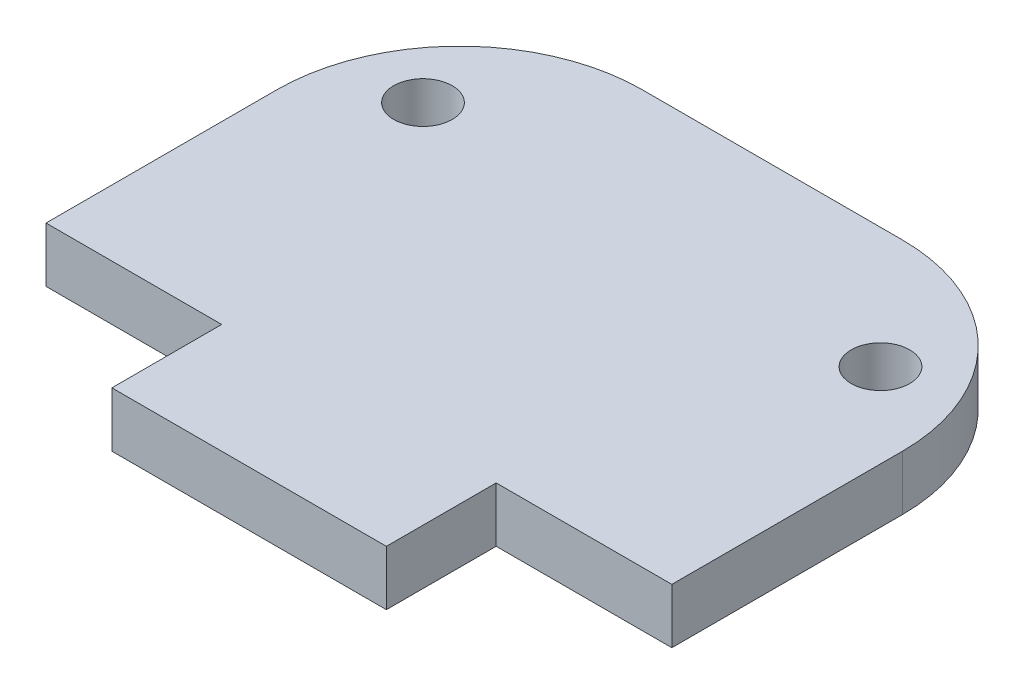
ISO-10303-21;
HEADER;
FILE_DESCRIPTION(('STEP AP214'),'2;1');
FILE_NAME('part.step','',(''),(''),'','','');
FILE_SCHEMA(('AUTOMOTIVE_DESIGN { 1 0 10303 214 1 1 1 1 }'));
ENDSEC;
DATA;
#1=APPLICATION_CONTEXT('core data for automotive mechanical design processes');
#2=APPLICATION_PROTOCOL_DEFINITION('international standard','automotive_design',2000,#1);
#3=PRODUCT_CONTEXT('',#1,'mechanical');
#4=PRODUCT('Part','Part','',(#3));
#5=PRODUCT_RELATED_PRODUCT_CATEGORY('part','',(#4));
#6=PRODUCT_DEFINITION_FORMATION('','',#4);
#7=PRODUCT_DEFINITION_CONTEXT('part definition',#1,'design');
#8=PRODUCT_DEFINITION('design','',#6,#7);
#9=PRODUCT_DEFINITION_SHAPE('','',#8);
#10=(LENGTH_UNIT() NAMED_UNIT(*) SI_UNIT(.MILLI.,.METRE.));
#11=(NAMED_UNIT(*) PLANE_ANGLE_UNIT() SI_UNIT($,.RADIAN.));
#12=(NAMED_UNIT(*) SI_UNIT($,.STERADIAN.) SOLID_ANGLE_UNIT());
#13=UNCERTAINTY_MEASURE_WITH_UNIT(LENGTH_MEASURE(1.E-05),#10,'distance_accuracy_value','');
#14=(GEOMETRIC_REPRESENTATION_CONTEXT(3) GLOBAL_UNCERTAINTY_ASSIGNED_CONTEXT((#13)) GLOBAL_UNIT_ASSIGNED_CONTEXT((#10,
#11,#12)) REPRESENTATION_CONTEXT('',''));
#15=CARTESIAN_POINT('',(0.,0.,0.));
#16=DIRECTION('',(0.,0.,1.));
#17=DIRECTION('',(1.,0.,0.));
#18=AXIS2_PLACEMENT_3D('',#15,#16,#17);
#19=CARTESIAN_POINT('',(-7.1,0.,-18.6));
#20=DIRECTION('',(0.,-1.,0.));
#21=DIRECTION('',(0.,0.,-1.));
#22=AXIS2_PLACEMENT_3D('',#19,#20,#21);
#23=CYLINDRICAL_SURFACE('',#22,9.99999999999999);
#24=CARTESIAN_POINT('',(-7.1,-3.,-18.6));
#25=DIRECTION('',(0.,-1.,0.));
#26=DIRECTION('',(0.,0.,-1.));
#27=AXIS2_PLACEMENT_3D('',#24,#25,#26);
#28=CIRCLE('',#27,9.99999999999999);
#29=CARTESIAN_POINT('',(-17.1,-3.,-18.6));
#30=VERTEX_POINT('',#29);
#31=CARTESIAN_POINT('',(-7.1,-3.,-28.6));
#32=VERTEX_POINT('',#31);
#33=EDGE_CURVE('E142',#30,#32,#28,.T.);
#34=ORIENTED_EDGE('',*,*,#33,.F.);
#35=DIRECTION('',(0.,-1.,0.));
#36=VECTOR('',#35,1.);
#37=CARTESIAN_POINT('',(-17.1,0.,-18.6));
#38=LINE('',#37,#36);
#39=CARTESIAN_POINT('',(-17.1,0.,-18.6));
#40=VERTEX_POINT('',#39);
#41=EDGE_CURVE('E11',#40,#30,#38,.T.);
#42=ORIENTED_EDGE('',*,*,#41,.F.);
#43=CARTESIAN_POINT('',(-7.1,0.,-18.6));
#44=DIRECTION('',(0.,-1.,0.));
#45=DIRECTION('',(0.,0.,-1.));
#46=AXIS2_PLACEMENT_3D('',#43,#44,#45);
#47=CIRCLE('',#46,9.99999999999999);
#48=CARTESIAN_POINT('',(-7.1,0.,-28.6));
#49=VERTEX_POINT('',#48);
#50=EDGE_CURVE('E169',#40,#49,#47,.T.);
#51=ORIENTED_EDGE('',*,*,#50,.T.);
#52=DIRECTION('',(0.,-1.,0.));
#53=VECTOR('',#52,1.);
#54=CARTESIAN_POINT('',(-7.1,0.,-28.6));
#55=LINE('',#54,#53);
#56=EDGE_CURVE('E36',#49,#32,#55,.T.);
#57=ORIENTED_EDGE('',*,*,#56,.T.);
#58=EDGE_LOOP('',(#34,#42,#51,#57));
#59=FACE_BOUND('',#58,.T.);
#60=ADVANCED_FACE('F33',(#59),#23,.T.);
#61=CARTESIAN_POINT('',(-17.1,0.,-6.00000000000001));
#62=DIRECTION('',(-1.,0.,0.));
#63=DIRECTION('',(0.,0.,1.));
#64=AXIS2_PLACEMENT_3D('',#61,#62,#63);
#65=PLANE('',#64);
#66=DIRECTION('',(0.,0.,-1.));
#67=VECTOR('',#66,1.);
#68=CARTESIAN_POINT('',(-17.1,-3.,-6.00000000000001));
#69=LINE('',#68,#67);
#70=CARTESIAN_POINT('',(-17.1,-3.,-6.00000000000001));
#71=VERTEX_POINT('',#70);
#72=EDGE_CURVE('E167',#71,#30,#69,.T.);
#73=ORIENTED_EDGE('',*,*,#72,.F.);
#74=DIRECTION('',(0.,-1.,0.));
#75=VECTOR('',#74,1.);
#76=CARTESIAN_POINT('',(-17.1,0.,-6.00000000000001));
#77=LINE('',#76,#75);
#78=CARTESIAN_POINT('',(-17.1,0.,-6.00000000000001));
#79=VERTEX_POINT('',#78);
#80=EDGE_CURVE('E42',#79,#71,#77,.T.);
#81=ORIENTED_EDGE('',*,*,#80,.F.);
#82=DIRECTION('',(0.,0.,-1.));
#83=VECTOR('',#82,1.);
#84=CARTESIAN_POINT('',(-17.1,0.,-6.00000000000001));
#85=LINE('',#84,#83);
#86=EDGE_CURVE('E132',#79,#40,#85,.T.);
#87=ORIENTED_EDGE('',*,*,#86,.T.);
#88=ORIENTED_EDGE('',*,*,#41,.T.);
#89=EDGE_LOOP('',(#73,#81,#87,#88));
#90=FACE_BOUND('',#89,.T.);
#91=ADVANCED_FACE('F185',(#90),#65,.T.);
#92=CARTESIAN_POINT('',(-7.5,0.,-6.00000000000001));
#93=DIRECTION('',(0.,0.,1.));
#94=DIRECTION('',(1.,0.,0.));
#95=AXIS2_PLACEMENT_3D('',#92,#93,#94);
#96=PLANE('',#95);
#97=DIRECTION('',(-1.,0.,0.));
#98=VECTOR('',#97,1.);
#99=CARTESIAN_POINT('',(-7.5,-3.,-6.00000000000001));
#100=LINE('',#99,#98);
#101=CARTESIAN_POINT('',(-7.5,-3.,-6.00000000000001));
#102=VERTEX_POINT('',#101);
#103=EDGE_CURVE('E119',#102,#71,#100,.T.);
#104=ORIENTED_EDGE('',*,*,#103,.F.);
#105=DIRECTION('',(0.,-1.,0.));
#106=VECTOR('',#105,1.);
#107=CARTESIAN_POINT('',(-7.5,0.,-6.00000000000001));
#108=LINE('',#107,#106);
#109=CARTESIAN_POINT('',(-7.5,0.,-6.00000000000001));
#110=VERTEX_POINT('',#109);
#111=EDGE_CURVE('E114',#110,#102,#108,.T.);
#112=ORIENTED_EDGE('',*,*,#111,.F.);
#113=DIRECTION('',(-1.,0.,0.));
#114=VECTOR('',#113,1.);
#115=CARTESIAN_POINT('',(-7.5,0.,-6.00000000000001));
#116=LINE('',#115,#114);
#117=EDGE_CURVE('E117',#110,#79,#116,.T.);
#118=ORIENTED_EDGE('',*,*,#117,.T.);
#119=ORIENTED_EDGE('',*,*,#80,.T.);
#120=EDGE_LOOP('',(#104,#112,#118,#119));
#121=FACE_BOUND('',#120,.T.);
#122=ADVANCED_FACE('F116',(#121),#96,.T.);
#123=CARTESIAN_POINT('',(-7.5,0.,0.));
#124=DIRECTION('',(-1.,0.,0.));
#125=DIRECTION('',(0.,0.,1.));
#126=AXIS2_PLACEMENT_3D('',#123,#124,#125);
#127=PLANE('',#126);
#128=DIRECTION('',(0.,0.,-1.));
#129=VECTOR('',#128,1.);
#130=CARTESIAN_POINT('',(-7.5,-3.,0.));
#131=LINE('',#130,#129);
#132=CARTESIAN_POINT('',(-7.5,-3.,0.));
#133=VERTEX_POINT('',#132);
#134=EDGE_CURVE('E164',#133,#102,#131,.T.);
#135=ORIENTED_EDGE('',*,*,#134,.F.);
#136=DIRECTION('',(0.,-1.,0.));
#137=VECTOR('',#136,1.);
#138=CARTESIAN_POINT('',(-7.5,0.,0.));
#139=LINE('',#138,#137);
#140=CARTESIAN_POINT('',(-7.5,0.,0.));
#141=VERTEX_POINT('',#140);
#142=EDGE_CURVE('E124',#141,#133,#139,.T.);
#143=ORIENTED_EDGE('',*,*,#142,.F.);
#144=DIRECTION('',(0.,0.,-1.));
#145=VECTOR('',#144,1.);
#146=CARTESIAN_POINT('',(-7.5,0.,0.));
#147=LINE('',#146,#145);
#148=EDGE_CURVE('E130',#141,#110,#147,.T.);
#149=ORIENTED_EDGE('',*,*,#148,.T.);
#150=ORIENTED_EDGE('',*,*,#111,.T.);
#151=EDGE_LOOP('',(#135,#143,#149,#150));
#152=FACE_BOUND('',#151,.T.);
#153=ADVANCED_FACE('F134',(#152),#127,.T.);
#154=CARTESIAN_POINT('',(7.5,0.,0.));
#155=DIRECTION('',(0.,0.,1.));
#156=DIRECTION('',(1.,0.,0.));
#157=AXIS2_PLACEMENT_3D('',#154,#155,#156);
#158=PLANE('',#157);
#159=DIRECTION('',(-1.,0.,0.));
#160=VECTOR('',#159,1.);
#161=CARTESIAN_POINT('',(7.5,-3.,0.));
#162=LINE('',#161,#160);
#163=CARTESIAN_POINT('',(7.5,-3.,0.));
#164=VERTEX_POINT('',#163);
#165=EDGE_CURVE('E161',#164,#133,#162,.T.);
#166=ORIENTED_EDGE('',*,*,#165,.F.);
#167=DIRECTION('',(0.,-1.,0.));
#168=VECTOR('',#167,1.);
#169=CARTESIAN_POINT('',(7.5,0.,0.));
#170=LINE('',#169,#168);
#171=CARTESIAN_POINT('',(7.5,0.,0.));
#172=VERTEX_POINT('',#171);
#173=EDGE_CURVE('E173',#172,#164,#170,.T.);
#174=ORIENTED_EDGE('',*,*,#173,.F.);
#175=DIRECTION('',(-1.,0.,0.));
#176=VECTOR('',#175,1.);
#177=CARTESIAN_POINT('',(7.5,0.,0.));
#178=LINE('',#177,#176);
#179=EDGE_CURVE('E135',#172,#141,#178,.T.);
#180=ORIENTED_EDGE('',*,*,#179,.T.);
#181=ORIENTED_EDGE('',*,*,#142,.T.);
#182=EDGE_LOOP('',(#166,#174,#180,#181));
#183=FACE_BOUND('',#182,.T.);
#184=ADVANCED_FACE('F198',(#183),#158,.T.);
#185=CARTESIAN_POINT('',(7.5,0.,-6.00000000000001));
#186=DIRECTION('',(1.,0.,0.));
#187=DIRECTION('',(0.,0.,-1.));
#188=AXIS2_PLACEMENT_3D('',#185,#186,#187);
#189=PLANE('',#188);
#190=DIRECTION('',(0.,0.,1.));
#191=VECTOR('',#190,1.);
#192=CARTESIAN_POINT('',(7.5,-3.,-6.00000000000001));
#193=LINE('',#192,#191);
#194=CARTESIAN_POINT('',(7.5,-3.,-6.00000000000001));
#195=VERTEX_POINT('',#194);
#196=EDGE_CURVE('E158',#195,#164,#193,.T.);
#197=ORIENTED_EDGE('',*,*,#196,.F.);
#198=DIRECTION('',(0.,-1.,0.));
#199=VECTOR('',#198,1.);
#200=CARTESIAN_POINT('',(7.5,0.,-6.00000000000001));
#201=LINE('',#200,#199);
#202=CARTESIAN_POINT('',(7.5,0.,-6.00000000000001));
#203=VERTEX_POINT('',#202);
#204=EDGE_CURVE('E175',#203,#195,#201,.T.);
#205=ORIENTED_EDGE('',*,*,#204,.F.);
#206=DIRECTION('',(0.,0.,1.));
#207=VECTOR('',#206,1.);
#208=CARTESIAN_POINT('',(7.5,0.,-6.00000000000001));
#209=LINE('',#208,#207);
#210=EDGE_CURVE('E137',#203,#172,#209,.T.);
#211=ORIENTED_EDGE('',*,*,#210,.T.);
#212=ORIENTED_EDGE('',*,*,#173,.T.);
#213=EDGE_LOOP('',(#197,#205,#211,#212));
#214=FACE_BOUND('',#213,.T.);
#215=ADVANCED_FACE('F201',(#214),#189,.T.);
#216=CARTESIAN_POINT('',(17.1,0.,-6.00000000000001));
#217=DIRECTION('',(0.,0.,1.));
#218=DIRECTION('',(1.,0.,0.));
#219=AXIS2_PLACEMENT_3D('',#216,#217,#218);
#220=PLANE('',#219);
#221=DIRECTION('',(-1.,0.,0.));
#222=VECTOR('',#221,1.);
#223=CARTESIAN_POINT('',(17.1,-3.,-6.00000000000001));
#224=LINE('',#223,#222);
#225=CARTESIAN_POINT('',(17.1,-3.,-6.00000000000001));
#226=VERTEX_POINT('',#225);
#227=EDGE_CURVE('E155',#226,#195,#224,.T.);
#228=ORIENTED_EDGE('',*,*,#227,.F.);
#229=DIRECTION('',(0.,-1.,0.));
#230=VECTOR('',#229,1.);
#231=CARTESIAN_POINT('',(17.1,0.,-6.00000000000001));
#232=LINE('',#231,#230);
#233=CARTESIAN_POINT('',(17.1,0.,-6.00000000000001));
#234=VERTEX_POINT('',#233);
#235=EDGE_CURVE('E177',#234,#226,#232,.T.);
#236=ORIENTED_EDGE('',*,*,#235,.F.);
#237=DIRECTION('',(-1.,0.,0.));
#238=VECTOR('',#237,1.);
#239=CARTESIAN_POINT('',(17.1,0.,-6.00000000000001));
#240=LINE('',#239,#238);
#241=EDGE_CURVE('E261',#234,#203,#240,.T.);
#242=ORIENTED_EDGE('',*,*,#241,.T.);
#243=ORIENTED_EDGE('',*,*,#204,.T.);
#244=EDGE_LOOP('',(#228,#236,#242,#243));
#245=FACE_BOUND('',#244,.T.);
#246=ADVANCED_FACE('F205',(#245),#220,.T.);
#247=CARTESIAN_POINT('',(17.1,0.,-18.6));
#248=DIRECTION('',(1.,0.,0.));
#249=DIRECTION('',(0.,0.,-1.));
#250=AXIS2_PLACEMENT_3D('',#247,#248,#249);
#251=PLANE('',#250);
#252=DIRECTION('',(0.,0.,1.));
#253=VECTOR('',#252,1.);
#254=CARTESIAN_POINT('',(17.1,-3.,-18.6));
#255=LINE('',#254,#253);
#256=CARTESIAN_POINT('',(17.1,-3.,-18.6));
#257=VERTEX_POINT('',#256);
#258=EDGE_CURVE('E152',#257,#226,#255,.T.);
#259=ORIENTED_EDGE('',*,*,#258,.F.);
#260=DIRECTION('',(0.,-1.,0.));
#261=VECTOR('',#260,1.);
#262=CARTESIAN_POINT('',(17.1,0.,-18.6));
#263=LINE('',#262,#261);
#264=CARTESIAN_POINT('',(17.1,0.,-18.6));
#265=VERTEX_POINT('',#264);
#266=EDGE_CURVE('E179',#265,#257,#263,.T.);
#267=ORIENTED_EDGE('',*,*,#266,.F.);
#268=DIRECTION('',(0.,0.,1.));
#269=VECTOR('',#268,1.);
#270=CARTESIAN_POINT('',(17.1,0.,-18.6));
#271=LINE('',#270,#269);
#272=EDGE_CURVE('E258',#265,#234,#271,.T.);
#273=ORIENTED_EDGE('',*,*,#272,.T.);
#274=ORIENTED_EDGE('',*,*,#235,.T.);
#275=EDGE_LOOP('',(#259,#267,#273,#274));
#276=FACE_BOUND('',#275,.T.);
#277=ADVANCED_FACE('F209',(#276),#251,.T.);
#278=CARTESIAN_POINT('',(7.1,0.,-18.6));
#279=DIRECTION('',(0.,-1.,0.));
#280=DIRECTION('',(0.,0.,-1.));
#281=AXIS2_PLACEMENT_3D('',#278,#279,#280);
#282=CYLINDRICAL_SURFACE('',#281,9.99999999999999);
#283=CARTESIAN_POINT('',(7.1,-3.,-18.6));
#284=DIRECTION('',(0.,-1.,0.));
#285=DIRECTION('',(0.,0.,-1.));
#286=AXIS2_PLACEMENT_3D('',#283,#284,#285);
#287=CIRCLE('',#286,9.99999999999999);
#288=CARTESIAN_POINT('',(7.1,-3.,-28.6));
#289=VERTEX_POINT('',#288);
#290=EDGE_CURVE('E149',#289,#257,#287,.T.);
#291=ORIENTED_EDGE('',*,*,#290,.F.);
#292=DIRECTION('',(0.,-1.,0.));
#293=VECTOR('',#292,1.);
#294=CARTESIAN_POINT('',(7.1,0.,-28.6));
#295=LINE('',#294,#293);
#296=CARTESIAN_POINT('',(7.1,0.,-28.6));
#297=VERTEX_POINT('',#296);
#298=EDGE_CURVE('E180',#297,#289,#295,.T.);
#299=ORIENTED_EDGE('',*,*,#298,.F.);
#300=CARTESIAN_POINT('',(7.1,0.,-18.6));
#301=DIRECTION('',(0.,-1.,0.));
#302=DIRECTION('',(0.,0.,-1.));
#303=AXIS2_PLACEMENT_3D('',#300,#301,#302);
#304=CIRCLE('',#303,9.99999999999999);
#305=EDGE_CURVE('E255',#297,#265,#304,.T.);
#306=ORIENTED_EDGE('',*,*,#305,.T.);
#307=ORIENTED_EDGE('',*,*,#266,.T.);
#308=EDGE_LOOP('',(#291,#299,#306,#307));
#309=FACE_BOUND('',#308,.T.);
#310=ADVANCED_FACE('F213',(#309),#282,.T.);
#311=CARTESIAN_POINT('',(-7.1,0.,-28.6));
#312=DIRECTION('',(0.,0.,-1.));
#313=DIRECTION('',(-1.,0.,0.));
#314=AXIS2_PLACEMENT_3D('',#311,#312,#313);
#315=PLANE('',#314);
#316=DIRECTION('',(1.,0.,0.));
#317=VECTOR('',#316,1.);
#318=CARTESIAN_POINT('',(-7.1,-3.,-28.6));
#319=LINE('',#318,#317);
#320=EDGE_CURVE('E145',#32,#289,#319,.T.);
#321=ORIENTED_EDGE('',*,*,#320,.F.);
#322=ORIENTED_EDGE('',*,*,#56,.F.);
#323=DIRECTION('',(1.,0.,0.));
#324=VECTOR('',#323,1.);
#325=CARTESIAN_POINT('',(-7.1,0.,-28.6));
#326=LINE('',#325,#324);
#327=EDGE_CURVE('E253',#49,#297,#326,.T.);
#328=ORIENTED_EDGE('',*,*,#327,.T.);
#329=ORIENTED_EDGE('',*,*,#298,.T.);
#330=EDGE_LOOP('',(#321,#322,#328,#329));
#331=FACE_BOUND('',#330,.T.);
#332=ADVANCED_FACE('F182',(#331),#315,.T.);
#333=CARTESIAN_POINT('',(-7.1,0.,-18.6));
#334=DIRECTION('',(0.,-1.,0.));
#335=DIRECTION('',(0.,0.,-1.));
#336=AXIS2_PLACEMENT_3D('',#333,#334,#335);
#337=PLANE('',#336);
#338=CARTESIAN_POINT('',(12.5,0.,-22.));
#339=DIRECTION('',(0.,-1.,0.));
#340=DIRECTION('',(0.,0.,1.));
#341=AXIS2_PLACEMENT_3D('',#338,#339,#340);
#342=CIRCLE('',#341,1.59999999999999);
#343=CARTESIAN_POINT('',(12.5,0.,-23.6));
#344=VERTEX_POINT('',#343);
#345=EDGE_CURVE('E240',#344,#344,#342,.T.);
#346=ORIENTED_EDGE('',*,*,#345,.T.);
#347=EDGE_LOOP('',(#346));
#348=FACE_BOUND('',#347,.T.);
#349=CARTESIAN_POINT('',(-12.5,0.,-22.));
#350=DIRECTION('',(0.,-1.,0.));
#351=DIRECTION('',(0.,0.,1.));
#352=AXIS2_PLACEMENT_3D('',#349,#350,#351);
#353=CIRCLE('',#352,1.59999999999999);
#354=CARTESIAN_POINT('',(-12.5,0.,-23.6));
#355=VERTEX_POINT('',#354);
#356=EDGE_CURVE('E146',#355,#355,#353,.T.);
#357=ORIENTED_EDGE('',*,*,#356,.T.);
#358=EDGE_LOOP('',(#357));
#359=FACE_BOUND('',#358,.T.);
#360=ORIENTED_EDGE('',*,*,#50,.F.);
#361=ORIENTED_EDGE('',*,*,#86,.F.);
#362=ORIENTED_EDGE('',*,*,#117,.F.);
#363=ORIENTED_EDGE('',*,*,#148,.F.);
#364=ORIENTED_EDGE('',*,*,#179,.F.);
#365=ORIENTED_EDGE('',*,*,#210,.F.);
#366=ORIENTED_EDGE('',*,*,#241,.F.);
#367=ORIENTED_EDGE('',*,*,#272,.F.);
#368=ORIENTED_EDGE('',*,*,#305,.F.);
#369=ORIENTED_EDGE('',*,*,#327,.F.);
#370=EDGE_LOOP('',(#360,#361,#362,#363,#364,#365,#366,#367,#368,#369));
#371=FACE_BOUND('',#370,.T.);
#372=ADVANCED_FACE('F128',(#348,#359,#371),#337,.F.);
#373=CARTESIAN_POINT('',(-7.1,-3.,-18.6));
#374=DIRECTION('',(0.,-1.,0.));
#375=DIRECTION('',(0.,0.,-1.));
#376=AXIS2_PLACEMENT_3D('',#373,#374,#375);
#377=PLANE('',#376);
#378=CARTESIAN_POINT('',(12.5,-3.,-22.));
#379=DIRECTION('',(0.,-1.,0.));
#380=DIRECTION('',(0.,0.,1.));
#381=AXIS2_PLACEMENT_3D('',#378,#379,#380);
#382=CIRCLE('',#381,1.59999999999999);
#383=CARTESIAN_POINT('',(12.5,-3.,-23.6));
#384=VERTEX_POINT('',#383);
#385=EDGE_CURVE('E243',#384,#384,#382,.T.);
#386=ORIENTED_EDGE('',*,*,#385,.F.);
#387=EDGE_LOOP('',(#386));
#388=FACE_BOUND('',#387,.T.);
#389=CARTESIAN_POINT('',(-12.5,-3.,-22.));
#390=DIRECTION('',(0.,-1.,0.));
#391=DIRECTION('',(0.,0.,1.));
#392=AXIS2_PLACEMENT_3D('',#389,#390,#391);
#393=CIRCLE('',#392,1.59999999999999);
#394=CARTESIAN_POINT('',(-12.5,-3.,-23.6));
#395=VERTEX_POINT('',#394);
#396=EDGE_CURVE('E245',#395,#395,#393,.T.);
#397=ORIENTED_EDGE('',*,*,#396,.F.);
#398=EDGE_LOOP('',(#397));
#399=FACE_BOUND('',#398,.T.);
#400=ORIENTED_EDGE('',*,*,#33,.T.);
#401=ORIENTED_EDGE('',*,*,#320,.T.);
#402=ORIENTED_EDGE('',*,*,#290,.T.);
#403=ORIENTED_EDGE('',*,*,#258,.T.);
#404=ORIENTED_EDGE('',*,*,#227,.T.);
#405=ORIENTED_EDGE('',*,*,#196,.T.);
#406=ORIENTED_EDGE('',*,*,#165,.T.);
#407=ORIENTED_EDGE('',*,*,#134,.T.);
#408=ORIENTED_EDGE('',*,*,#103,.T.);
#409=ORIENTED_EDGE('',*,*,#72,.T.);
#410=EDGE_LOOP('',(#400,#401,#402,#403,#404,#405,#406,#407,#408,#409));
#411=FACE_BOUND('',#410,.T.);
#412=ADVANCED_FACE('F184',(#388,#399,#411),#377,.T.);
#413=CARTESIAN_POINT('',(-12.5,0.,-22.));
#414=DIRECTION('',(0.,-1.,0.));
#415=DIRECTION('',(0.,0.,-1.));
#416=AXIS2_PLACEMENT_3D('',#413,#414,#415);
#417=CYLINDRICAL_SURFACE('',#416,1.59999999999999);
#418=CARTESIAN_POINT('',(-12.5,0.,-23.6));
#419=CARTESIAN_POINT('',(-12.5,-0.0312499999999995,-23.6));
#420=CARTESIAN_POINT('',(-12.5,-0.0624999999999996,-23.6));
#421=CARTESIAN_POINT('',(-12.5,-0.125,-23.6));
#422=CARTESIAN_POINT('',(-12.5,-0.15625,-23.6));
#423=CARTESIAN_POINT('',(-12.5,-0.21875,-23.6));
#424=CARTESIAN_POINT('',(-12.5,-0.25,-23.6));
#425=CARTESIAN_POINT('',(-12.5,-0.3125,-23.6));
#426=CARTESIAN_POINT('',(-12.5,-0.34375,-23.6));
#427=CARTESIAN_POINT('',(-12.5,-0.40625,-23.6));
#428=CARTESIAN_POINT('',(-12.5,-0.4375,-23.6));
#429=CARTESIAN_POINT('',(-12.5,-0.5,-23.6));
#430=CARTESIAN_POINT('',(-12.5,-0.53125,-23.6));
#431=CARTESIAN_POINT('',(-12.5,-0.59375,-23.6));
#432=CARTESIAN_POINT('',(-12.5,-0.625,-23.6));
#433=CARTESIAN_POINT('',(-12.5,-0.6875,-23.6));
#434=CARTESIAN_POINT('',(-12.5,-0.71875,-23.6));
#435=CARTESIAN_POINT('',(-12.5,-0.78125,-23.6));
#436=CARTESIAN_POINT('',(-12.5,-0.8125,-23.6));
#437=CARTESIAN_POINT('',(-12.5,-0.875,-23.6));
#438=CARTESIAN_POINT('',(-12.5,-0.90625,-23.6));
#439=CARTESIAN_POINT('',(-12.5,-0.96875,-23.6));
#440=CARTESIAN_POINT('',(-12.5,-1.,-23.6));
#441=CARTESIAN_POINT('',(-12.5,-1.0625,-23.6));
#442=CARTESIAN_POINT('',(-12.5,-1.09375,-23.6));
#443=CARTESIAN_POINT('',(-12.5,-1.15625,-23.6));
#444=CARTESIAN_POINT('',(-12.5,-1.1875,-23.6));
#445=CARTESIAN_POINT('',(-12.5,-1.25,-23.6));
#446=CARTESIAN_POINT('',(-12.5,-1.28125,-23.6));
#447=CARTESIAN_POINT('',(-12.5,-1.34375,-23.6));
#448=CARTESIAN_POINT('',(-12.5,-1.375,-23.6));
#449=CARTESIAN_POINT('',(-12.5,-1.4375,-23.6));
#450=CARTESIAN_POINT('',(-12.5,-1.46875,-23.6));
#451=CARTESIAN_POINT('',(-12.5,-1.53125,-23.6));
#452=CARTESIAN_POINT('',(-12.5,-1.5625,-23.6));
#453=CARTESIAN_POINT('',(-12.5,-1.625,-23.6));
#454=CARTESIAN_POINT('',(-12.5,-1.65625,-23.6));
#455=CARTESIAN_POINT('',(-12.5,-1.71875,-23.6));
#456=CARTESIAN_POINT('',(-12.5,-1.75,-23.6));
#457=CARTESIAN_POINT('',(-12.5,-1.8125,-23.6));
#458=CARTESIAN_POINT('',(-12.5,-1.84375,-23.6));
#459=CARTESIAN_POINT('',(-12.5,-1.90625,-23.6));
#460=CARTESIAN_POINT('',(-12.5,-1.9375,-23.6));
#461=CARTESIAN_POINT('',(-12.5,-2.,-23.6));
#462=CARTESIAN_POINT('',(-12.5,-2.03125,-23.6));
#463=CARTESIAN_POINT('',(-12.5,-2.09375,-23.6));
#464=CARTESIAN_POINT('',(-12.5,-2.125,-23.6));
#465=CARTESIAN_POINT('',(-12.5,-2.1875,-23.6));
#466=CARTESIAN_POINT('',(-12.5,-2.21875,-23.6));
#467=CARTESIAN_POINT('',(-12.5,-2.28125,-23.6));
#468=CARTESIAN_POINT('',(-12.5,-2.3125,-23.6));
#469=CARTESIAN_POINT('',(-12.5,-2.375,-23.6));
#470=CARTESIAN_POINT('',(-12.5,-2.40625,-23.6));
#471=CARTESIAN_POINT('',(-12.5,-2.46875,-23.6));
#472=CARTESIAN_POINT('',(-12.5,-2.5,-23.6));
#473=CARTESIAN_POINT('',(-12.5,-2.5625,-23.6));
#474=CARTESIAN_POINT('',(-12.5,-2.59375,-23.6));
#475=CARTESIAN_POINT('',(-12.5,-2.65625,-23.6));
#476=CARTESIAN_POINT('',(-12.5,-2.6875,-23.6));
#477=CARTESIAN_POINT('',(-12.5,-2.75,-23.6));
#478=CARTESIAN_POINT('',(-12.5,-2.78125,-23.6));
#479=CARTESIAN_POINT('',(-12.5,-2.84375,-23.6));
#480=CARTESIAN_POINT('',(-12.5,-2.875,-23.6));
#481=CARTESIAN_POINT('',(-12.5,-2.9375,-23.6));
#482=CARTESIAN_POINT('',(-12.5,-2.96875,-23.6));
#483=CARTESIAN_POINT('',(-12.5,-3.,-23.6));
#484=B_SPLINE_CURVE_WITH_KNOTS('',3,(#418,#419,#420,#421,#422,#423,#424,#425,#426,#427,#428,
#429,#430,#431,#432,#433,#434,#435,#436,#437,#438,#439,#440,#441,#442,#443,#444,#445,#446,#447,
#448,#449,#450,#451,#452,#453,#454,#455,#456,#457,#458,#459,#460,#461,#462,#463,#464,#465,#466,
#467,#468,#469,#470,#471,#472,#473,#474,#475,#476,#477,#478,#479,#480,#481,#482,#483),
.UNSPECIFIED.,.F.,.F.,(4,2,2,2,2,2,2,2,2,2,2,2,2,2,2,2,2,2,2,2,2,2,2,2,2,2,2,2,2,2,2,2,4),(0.,
0.09375,0.1875,0.28125,0.375,0.46875,0.5625,0.65625,0.75,0.84375,0.9375,1.03125,1.125,1.21875,
1.3125,1.40625,1.5,1.59375,1.6875,1.78125,1.875,1.96875,2.0625,2.15625,2.25,2.34375,2.4375,
2.53125,2.625,2.71875,2.8125,2.90625,3.),.UNSPECIFIED.);
#485=EDGE_CURVE('BSEAM225',#355,#395,#484,.T.);
#486=ORIENTED_EDGE('',*,*,#356,.F.);
#487=ORIENTED_EDGE('',*,*,#396,.T.);
#488=ORIENTED_EDGE('',*,*,#485,.T.);
#489=ORIENTED_EDGE('',*,*,#485,.F.);
#490=EDGE_LOOP('',(#486,#488,#487,#489));
#491=FACE_BOUND('',#490,.T.);
#492=ADVANCED_FACE('F225',(#491),#417,.F.);
#493=CARTESIAN_POINT('',(12.5,0.,-22.));
#494=DIRECTION('',(0.,-1.,0.));
#495=DIRECTION('',(0.,0.,-1.));
#496=AXIS2_PLACEMENT_3D('',#493,#494,#495);
#497=CYLINDRICAL_SURFACE('',#496,1.59999999999999);
#498=CARTESIAN_POINT('',(12.5,0.,-23.6));
#499=CARTESIAN_POINT('',(12.5,-0.0312499999999995,-23.6));
#500=CARTESIAN_POINT('',(12.5,-0.0624999999999996,-23.6));
#501=CARTESIAN_POINT('',(12.5,-0.125,-23.6));
#502=CARTESIAN_POINT('',(12.5,-0.15625,-23.6));
#503=CARTESIAN_POINT('',(12.5,-0.21875,-23.6));
#504=CARTESIAN_POINT('',(12.5,-0.25,-23.6));
#505=CARTESIAN_POINT('',(12.5,-0.3125,-23.6));
#506=CARTESIAN_POINT('',(12.5,-0.34375,-23.6));
#507=CARTESIAN_POINT('',(12.5,-0.40625,-23.6));
#508=CARTESIAN_POINT('',(12.5,-0.4375,-23.6));
#509=CARTESIAN_POINT('',(12.5,-0.5,-23.6));
#510=CARTESIAN_POINT('',(12.5,-0.53125,-23.6));
#511=CARTESIAN_POINT('',(12.5,-0.59375,-23.6));
#512=CARTESIAN_POINT('',(12.5,-0.625,-23.6));
#513=CARTESIAN_POINT('',(12.5,-0.6875,-23.6));
#514=CARTESIAN_POINT('',(12.5,-0.71875,-23.6));
#515=CARTESIAN_POINT('',(12.5,-0.78125,-23.6));
#516=CARTESIAN_POINT('',(12.5,-0.8125,-23.6));
#517=CARTESIAN_POINT('',(12.5,-0.875,-23.6));
#518=CARTESIAN_POINT('',(12.5,-0.90625,-23.6));
#519=CARTESIAN_POINT('',(12.5,-0.96875,-23.6));
#520=CARTESIAN_POINT('',(12.5,-1.,-23.6));
#521=CARTESIAN_POINT('',(12.5,-1.0625,-23.6));
#522=CARTESIAN_POINT('',(12.5,-1.09375,-23.6));
#523=CARTESIAN_POINT('',(12.5,-1.15625,-23.6));
#524=CARTESIAN_POINT('',(12.5,-1.1875,-23.6));
#525=CARTESIAN_POINT('',(12.5,-1.25,-23.6));
#526=CARTESIAN_POINT('',(12.5,-1.28125,-23.6));
#527=CARTESIAN_POINT('',(12.5,-1.34375,-23.6));
#528=CARTESIAN_POINT('',(12.5,-1.375,-23.6));
#529=CARTESIAN_POINT('',(12.5,-1.4375,-23.6));
#530=CARTESIAN_POINT('',(12.5,-1.46875,-23.6));
#531=CARTESIAN_POINT('',(12.5,-1.53125,-23.6));
#532=CARTESIAN_POINT('',(12.5,-1.5625,-23.6));
#533=CARTESIAN_POINT('',(12.5,-1.625,-23.6));
#534=CARTESIAN_POINT('',(12.5,-1.65625,-23.6));
#535=CARTESIAN_POINT('',(12.5,-1.71875,-23.6));
#536=CARTESIAN_POINT('',(12.5,-1.75,-23.6));
#537=CARTESIAN_POINT('',(12.5,-1.8125,-23.6));
#538=CARTESIAN_POINT('',(12.5,-1.84375,-23.6));
#539=CARTESIAN_POINT('',(12.5,-1.90625,-23.6));
#540=CARTESIAN_POINT('',(12.5,-1.9375,-23.6));
#541=CARTESIAN_POINT('',(12.5,-2.,-23.6));
#542=CARTESIAN_POINT('',(12.5,-2.03125,-23.6));
#543=CARTESIAN_POINT('',(12.5,-2.09375,-23.6));
#544=CARTESIAN_POINT('',(12.5,-2.125,-23.6));
#545=CARTESIAN_POINT('',(12.5,-2.1875,-23.6));
#546=CARTESIAN_POINT('',(12.5,-2.21875,-23.6));
#547=CARTESIAN_POINT('',(12.5,-2.28125,-23.6));
#548=CARTESIAN_POINT('',(12.5,-2.3125,-23.6));
#549=CARTESIAN_POINT('',(12.5,-2.375,-23.6));
#550=CARTESIAN_POINT('',(12.5,-2.40625,-23.6));
#551=CARTESIAN_POINT('',(12.5,-2.46875,-23.6));
#552=CARTESIAN_POINT('',(12.5,-2.5,-23.6));
#553=CARTESIAN_POINT('',(12.5,-2.5625,-23.6));
#554=CARTESIAN_POINT('',(12.5,-2.59375,-23.6));
#555=CARTESIAN_POINT('',(12.5,-2.65625,-23.6));
#556=CARTESIAN_POINT('',(12.5,-2.6875,-23.6));
#557=CARTESIAN_POINT('',(12.5,-2.75,-23.6));
#558=CARTESIAN_POINT('',(12.5,-2.78125,-23.6));
#559=CARTESIAN_POINT('',(12.5,-2.84375,-23.6));
#560=CARTESIAN_POINT('',(12.5,-2.875,-23.6));
#561=CARTESIAN_POINT('',(12.5,-2.9375,-23.6));
#562=CARTESIAN_POINT('',(12.5,-2.96875,-23.6));
#563=CARTESIAN_POINT('',(12.5,-3.,-23.6));
#564=B_SPLINE_CURVE_WITH_KNOTS('',3,(#498,#499,#500,#501,#502,#503,#504,#505,#506,#507,#508,
#509,#510,#511,#512,#513,#514,#515,#516,#517,#518,#519,#520,#521,#522,#523,#524,#525,#526,#527,
#528,#529,#530,#531,#532,#533,#534,#535,#536,#537,#538,#539,#540,#541,#542,#543,#544,#545,#546,
#547,#548,#549,#550,#551,#552,#553,#554,#555,#556,#557,#558,#559,#560,#561,#562,#563),
.UNSPECIFIED.,.F.,.F.,(4,2,2,2,2,2,2,2,2,2,2,2,2,2,2,2,2,2,2,2,2,2,2,2,2,2,2,2,2,2,2,2,4),(0.,
0.09375,0.1875,0.28125,0.375,0.46875,0.5625,0.65625,0.75,0.84375,0.9375,1.03125,1.125,1.21875,
1.3125,1.40625,1.5,1.59375,1.6875,1.78125,1.875,1.96875,2.0625,2.15625,2.25,2.34375,2.4375,
2.53125,2.625,2.71875,2.8125,2.90625,3.),.UNSPECIFIED.);
#565=EDGE_CURVE('BSEAM232',#344,#384,#564,.T.);
#566=ORIENTED_EDGE('',*,*,#345,.F.);
#567=ORIENTED_EDGE('',*,*,#385,.T.);
#568=ORIENTED_EDGE('',*,*,#565,.T.);
#569=ORIENTED_EDGE('',*,*,#565,.F.);
#570=EDGE_LOOP('',(#566,#568,#567,#569));
#571=FACE_BOUND('',#570,.T.);
#572=ADVANCED_FACE('F232',(#571),#497,.F.);
#573=CLOSED_SHELL('',(#60,#91,#122,#153,#184,#215,#246,#277,#310,#332,#372,#412,#492,#572));
#574=MANIFOLD_SOLID_BREP('B2',#573);
#575=ADVANCED_BREP_SHAPE_REPRESENTATION('',(#18,#574),#14);
#576=SHAPE_DEFINITION_REPRESENTATION(#9,#575);
ENDSEC;
END-ISO-10303-21;
